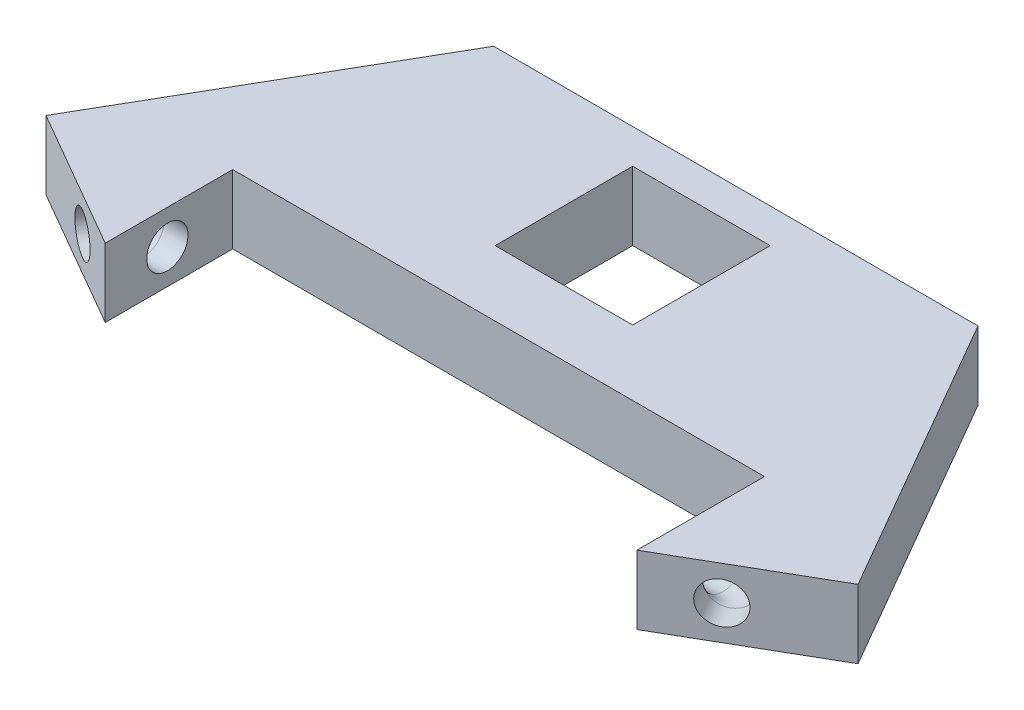
ISO-10303-21;
HEADER;
FILE_DESCRIPTION(('STEP AP214'),'2;1');
FILE_NAME('part.step','',(''),(''),'','','');
FILE_SCHEMA(('AUTOMOTIVE_DESIGN { 1 0 10303 214 1 1 1 1 }'));
ENDSEC;
DATA;
#1=APPLICATION_CONTEXT('core data for automotive mechanical design processes');
#2=APPLICATION_PROTOCOL_DEFINITION('international standard','automotive_design',2000,#1);
#3=PRODUCT_CONTEXT('',#1,'mechanical');
#4=PRODUCT('Part','Part','',(#3));
#5=PRODUCT_RELATED_PRODUCT_CATEGORY('part','',(#4));
#6=PRODUCT_DEFINITION_FORMATION('','',#4);
#7=PRODUCT_DEFINITION_CONTEXT('part definition',#1,'design');
#8=PRODUCT_DEFINITION('design','',#6,#7);
#9=PRODUCT_DEFINITION_SHAPE('','',#8);
#10=(LENGTH_UNIT() NAMED_UNIT(*) SI_UNIT(.MILLI.,.METRE.));
#11=(NAMED_UNIT(*) PLANE_ANGLE_UNIT() SI_UNIT($,.RADIAN.));
#12=(NAMED_UNIT(*) SI_UNIT($,.STERADIAN.) SOLID_ANGLE_UNIT());
#13=UNCERTAINTY_MEASURE_WITH_UNIT(LENGTH_MEASURE(1.E-05),#10,'distance_accuracy_value','');
#14=(GEOMETRIC_REPRESENTATION_CONTEXT(3) GLOBAL_UNCERTAINTY_ASSIGNED_CONTEXT((#13)) GLOBAL_UNIT_ASSIGNED_CONTEXT((#10,
#11,#12)) REPRESENTATION_CONTEXT('',''));
#15=CARTESIAN_POINT('',(0.,0.,0.));
#16=DIRECTION('',(0.,0.,1.));
#17=DIRECTION('',(1.,0.,0.));
#18=AXIS2_PLACEMENT_3D('',#15,#16,#17);
#19=CARTESIAN_POINT('',(-19.3308710467706,10.,-33.4820508075688));
#20=DIRECTION('',(-0.5,0.,-0.866025403784438));
#21=DIRECTION('',(-0.866025403784439,0.,0.5));
#22=AXIS2_PLACEMENT_3D('',#19,#20,#21);
#23=PLANE('',#22);
#24=CARTESIAN_POINT('',(46.4870596408467,5.,-71.4820508075689));
#25=DIRECTION('',(-0.5,0.,-0.866025403784438));
#26=DIRECTION('',(-0.866025403784439,0.,0.5));
#27=AXIS2_PLACEMENT_3D('',#24,#25,#26);
#28=CIRCLE('',#27,3.00000000000001);
#29=CARTESIAN_POINT('',(43.8889834294934,5.,-69.9820508075689));
#30=VERTEX_POINT('',#29);
#31=EDGE_CURVE('E427',#30,#30,#28,.T.);
#32=ORIENTED_EDGE('',*,*,#31,.T.);
#33=EDGE_LOOP('',(#32));
#34=FACE_BOUND('',#33,.T.);
#35=DIRECTION('',(0.866025403784439,0.,-0.5));
#36=VECTOR('',#35,1.);
#37=CARTESIAN_POINT('',(-19.3308710467706,0.,-33.4820508075688));
#38=LINE('',#37,#36);
#39=CARTESIAN_POINT('',(38.6617420935412,0.,-66.9641016151377));
#40=VERTEX_POINT('',#39);
#41=CARTESIAN_POINT('',(59.0444279957211,0.,-78.7320508075688));
#42=VERTEX_POINT('',#41);
#43=EDGE_CURVE('E170',#40,#42,#38,.T.);
#44=ORIENTED_EDGE('',*,*,#43,.T.);
#45=DIRECTION('',(0.,-1.,0.));
#46=VECTOR('',#45,1.);
#47=CARTESIAN_POINT('',(59.0444279957211,10.,-78.7320508075688));
#48=LINE('',#47,#46);
#49=CARTESIAN_POINT('',(59.0444279957211,10.,-78.7320508075688));
#50=VERTEX_POINT('',#49);
#51=EDGE_CURVE('E11',#50,#42,#48,.T.);
#52=ORIENTED_EDGE('',*,*,#51,.F.);
#53=DIRECTION('',(0.866025403784439,0.,-0.5));
#54=VECTOR('',#53,1.);
#55=CARTESIAN_POINT('',(-19.3308710467706,10.,-33.4820508075688));
#56=LINE('',#55,#54);
#57=CARTESIAN_POINT('',(38.6617420935412,10.,-66.9641016151377));
#58=VERTEX_POINT('',#57);
#59=EDGE_CURVE('E223',#58,#50,#56,.T.);
#60=ORIENTED_EDGE('',*,*,#59,.F.);
#61=DIRECTION('',(0.,-1.,0.));
#62=VECTOR('',#61,1.);
#63=CARTESIAN_POINT('',(38.6617420935412,10.,-66.9641016151377));
#64=LINE('',#63,#62);
#65=EDGE_CURVE('E189',#58,#40,#64,.T.);
#66=ORIENTED_EDGE('',*,*,#65,.T.);
#67=EDGE_LOOP('',(#44,#52,#60,#66));
#68=FACE_BOUND('',#67,.T.);
#69=ADVANCED_FACE('F33',(#34,#68),#23,.F.);
#70=CARTESIAN_POINT('',(78.3752990424917,10.,-45.25));
#71=DIRECTION('',(0.866025403784438,0.,-0.5));
#72=DIRECTION('',(-0.5,0.,-0.866025403784438));
#73=AXIS2_PLACEMENT_3D('',#70,#71,#72);
#74=PLANE('',#73);
#75=DIRECTION('',(0.5,0.,0.866025403784439));
#76=VECTOR('',#75,1.);
#77=CARTESIAN_POINT('',(78.3752990424917,0.,-45.25));
#78=LINE('',#77,#76);
#79=CARTESIAN_POINT('',(35.2183664205671,0.,-120.));
#80=VERTEX_POINT('',#79);
#81=EDGE_CURVE('E173',#80,#42,#78,.T.);
#82=ORIENTED_EDGE('',*,*,#81,.F.);
#83=DIRECTION('',(0.,-1.,0.));
#84=VECTOR('',#83,1.);
#85=CARTESIAN_POINT('',(35.2183664205671,10.,-120.));
#86=LINE('',#85,#84);
#87=CARTESIAN_POINT('',(35.2183664205671,10.,-120.));
#88=VERTEX_POINT('',#87);
#89=EDGE_CURVE('E43',#88,#80,#86,.T.);
#90=ORIENTED_EDGE('',*,*,#89,.F.);
#91=DIRECTION('',(0.5,0.,0.866025403784439));
#92=VECTOR('',#91,1.);
#93=CARTESIAN_POINT('',(78.3752990424917,10.,-45.25));
#94=LINE('',#93,#92);
#95=EDGE_CURVE('E226',#88,#50,#94,.T.);
#96=ORIENTED_EDGE('',*,*,#95,.T.);
#97=ORIENTED_EDGE('',*,*,#51,.T.);
#98=EDGE_LOOP('',(#82,#90,#96,#97));
#99=FACE_BOUND('',#98,.T.);
#100=ADVANCED_FACE('F261',(#99),#74,.T.);
#101=CARTESIAN_POINT('',(0.,10.,-120.));
#102=DIRECTION('',(0.,0.,-1.));
#103=DIRECTION('',(-1.,0.,0.));
#104=AXIS2_PLACEMENT_3D('',#101,#102,#103);
#105=PLANE('',#104);
#106=DIRECTION('',(1.,0.,0.));
#107=VECTOR('',#106,1.);
#108=CARTESIAN_POINT('',(0.,0.,-120.));
#109=LINE('',#108,#107);
#110=CARTESIAN_POINT('',(-35.2183664205671,0.,-120.));
#111=VERTEX_POINT('',#110);
#112=EDGE_CURVE('E176',#111,#80,#109,.T.);
#113=ORIENTED_EDGE('',*,*,#112,.F.);
#114=DIRECTION('',(0.,-1.,0.));
#115=VECTOR('',#114,1.);
#116=CARTESIAN_POINT('',(-35.2183664205671,10.,-120.));
#117=LINE('',#116,#115);
#118=CARTESIAN_POINT('',(-35.2183664205671,10.,-120.));
#119=VERTEX_POINT('',#118);
#120=EDGE_CURVE('E195',#119,#111,#117,.T.);
#121=ORIENTED_EDGE('',*,*,#120,.F.);
#122=DIRECTION('',(1.,0.,0.));
#123=VECTOR('',#122,1.);
#124=CARTESIAN_POINT('',(0.,10.,-120.));
#125=LINE('',#124,#123);
#126=EDGE_CURVE('E233',#119,#88,#125,.T.);
#127=ORIENTED_EDGE('',*,*,#126,.T.);
#128=ORIENTED_EDGE('',*,*,#89,.T.);
#129=EDGE_LOOP('',(#113,#121,#127,#128));
#130=FACE_BOUND('',#129,.T.);
#131=ADVANCED_FACE('F267',(#130),#105,.T.);
#132=CARTESIAN_POINT('',(-78.3752990424917,10.,-45.25));
#133=DIRECTION('',(-0.866025403784438,0.,-0.5));
#134=DIRECTION('',(-0.5,0.,0.866025403784439));
#135=AXIS2_PLACEMENT_3D('',#132,#133,#134);
#136=PLANE('',#135);
#137=DIRECTION('',(0.5,0.,-0.866025403784439));
#138=VECTOR('',#137,1.);
#139=CARTESIAN_POINT('',(-78.3752990424917,0.,-45.25));
#140=LINE('',#139,#138);
#141=CARTESIAN_POINT('',(-59.0444279957211,0.,-78.7320508075688));
#142=VERTEX_POINT('',#141);
#143=EDGE_CURVE('E179',#142,#111,#140,.T.);
#144=ORIENTED_EDGE('',*,*,#143,.F.);
#145=DIRECTION('',(0.,-1.,0.));
#146=VECTOR('',#145,1.);
#147=CARTESIAN_POINT('',(-59.0444279957211,10.,-78.7320508075688));
#148=LINE('',#147,#146);
#149=CARTESIAN_POINT('',(-59.0444279957211,10.,-78.7320508075688));
#150=VERTEX_POINT('',#149);
#151=EDGE_CURVE('E193',#150,#142,#148,.T.);
#152=ORIENTED_EDGE('',*,*,#151,.F.);
#153=DIRECTION('',(0.5,0.,-0.866025403784439));
#154=VECTOR('',#153,1.);
#155=CARTESIAN_POINT('',(-78.3752990424917,10.,-45.25));
#156=LINE('',#155,#154);
#157=EDGE_CURVE('E236',#150,#119,#156,.T.);
#158=ORIENTED_EDGE('',*,*,#157,.T.);
#159=ORIENTED_EDGE('',*,*,#120,.T.);
#160=EDGE_LOOP('',(#144,#152,#158,#159));
#161=FACE_BOUND('',#160,.T.);
#162=ADVANCED_FACE('F289',(#161),#136,.T.);
#163=CARTESIAN_POINT('',(19.3308710467706,10.,-33.4820508075686));
#164=DIRECTION('',(-0.500000000000002,0.,0.866025403784437));
#165=DIRECTION('',(0.866025403784437,0.,0.500000000000002));
#166=AXIS2_PLACEMENT_3D('',#163,#164,#165);
#167=PLANE('',#166);
#168=CARTESIAN_POINT('',(-46.4870596408467,5.,-71.4820508075688));
#169=DIRECTION('',(-0.500000000000002,0.,0.866025403784437));
#170=DIRECTION('',(0.866025403784437,0.,0.500000000000002));
#171=AXIS2_PLACEMENT_3D('',#168,#169,#170);
#172=CIRCLE('',#171,3.00000000000001);
#173=CARTESIAN_POINT('',(-43.8889834294934,5.,-69.9820508075688));
#174=VERTEX_POINT('',#173);
#175=EDGE_CURVE('E162',#174,#174,#172,.T.);
#176=ORIENTED_EDGE('',*,*,#175,.F.);
#177=EDGE_LOOP('',(#176));
#178=FACE_BOUND('',#177,.T.);
#179=DIRECTION('',(-0.866025403784437,0.,-0.500000000000002));
#180=VECTOR('',#179,1.);
#181=CARTESIAN_POINT('',(19.3308710467706,0.,-33.4820508075686));
#182=LINE('',#181,#180);
#183=CARTESIAN_POINT('',(-38.6617420935412,0.,-66.9641016151377));
#184=VERTEX_POINT('',#183);
#185=EDGE_CURVE('E182',#184,#142,#182,.T.);
#186=ORIENTED_EDGE('',*,*,#185,.F.);
#187=DIRECTION('',(0.,-1.,0.));
#188=VECTOR('',#187,1.);
#189=CARTESIAN_POINT('',(-38.6617420935412,10.,-66.9641016151377));
#190=LINE('',#189,#188);
#191=CARTESIAN_POINT('',(-38.6617420935412,10.,-66.9641016151377));
#192=VERTEX_POINT('',#191);
#193=EDGE_CURVE('E149',#192,#184,#190,.T.);
#194=ORIENTED_EDGE('',*,*,#193,.F.);
#195=DIRECTION('',(-0.866025403784437,0.,-0.500000000000002));
#196=VECTOR('',#195,1.);
#197=CARTESIAN_POINT('',(19.3308710467706,10.,-33.4820508075686));
#198=LINE('',#197,#196);
#199=EDGE_CURVE('E142',#192,#150,#198,.T.);
#200=ORIENTED_EDGE('',*,*,#199,.T.);
#201=ORIENTED_EDGE('',*,*,#151,.T.);
#202=EDGE_LOOP('',(#186,#194,#200,#201));
#203=FACE_BOUND('',#202,.T.);
#204=ADVANCED_FACE('F240',(#178,#203),#167,.T.);
#205=CARTESIAN_POINT('',(-38.6617420935412,10.,0.));
#206=DIRECTION('',(-1.,0.,0.));
#207=DIRECTION('',(0.,0.,1.));
#208=AXIS2_PLACEMENT_3D('',#205,#206,#207);
#209=PLANE('',#208);
#210=CARTESIAN_POINT('',(-38.6617420935412,5.,-76.));
#211=DIRECTION('',(-1.,0.,0.));
#212=DIRECTION('',(0.,0.,1.));
#213=AXIS2_PLACEMENT_3D('',#210,#211,#212);
#214=CIRCLE('',#213,3.00000000000001);
#215=CARTESIAN_POINT('',(-38.6617420935412,5.,-73.));
#216=VERTEX_POINT('',#215);
#217=EDGE_CURVE('E441',#216,#216,#214,.T.);
#218=ORIENTED_EDGE('',*,*,#217,.T.);
#219=EDGE_LOOP('',(#218));
#220=FACE_BOUND('',#219,.T.);
#221=DIRECTION('',(0.,0.,-1.));
#222=VECTOR('',#221,1.);
#223=CARTESIAN_POINT('',(-38.6617420935412,0.,0.));
#224=LINE('',#223,#222);
#225=CARTESIAN_POINT('',(-38.6617420935412,0.,-85.5));
#226=VERTEX_POINT('',#225);
#227=EDGE_CURVE('E148',#184,#226,#224,.T.);
#228=ORIENTED_EDGE('',*,*,#227,.T.);
#229=DIRECTION('',(0.,-1.,0.));
#230=VECTOR('',#229,1.);
#231=CARTESIAN_POINT('',(-38.6617420935412,10.,-85.5));
#232=LINE('',#231,#230);
#233=CARTESIAN_POINT('',(-38.6617420935412,10.,-85.5));
#234=VERTEX_POINT('',#233);
#235=EDGE_CURVE('E145',#234,#226,#232,.T.);
#236=ORIENTED_EDGE('',*,*,#235,.F.);
#237=DIRECTION('',(0.,0.,-1.));
#238=VECTOR('',#237,1.);
#239=CARTESIAN_POINT('',(-38.6617420935412,10.,0.));
#240=LINE('',#239,#238);
#241=EDGE_CURVE('E135',#192,#234,#240,.T.);
#242=ORIENTED_EDGE('',*,*,#241,.F.);
#243=ORIENTED_EDGE('',*,*,#193,.T.);
#244=EDGE_LOOP('',(#228,#236,#242,#243));
#245=FACE_BOUND('',#244,.T.);
#246=ADVANCED_FACE('F146',(#220,#245),#209,.F.);
#247=CARTESIAN_POINT('',(0.,10.,-85.5));
#248=DIRECTION('',(0.,0.,-1.));
#249=DIRECTION('',(-1.,0.,0.));
#250=AXIS2_PLACEMENT_3D('',#247,#248,#249);
#251=PLANE('',#250);
#252=DIRECTION('',(1.,0.,0.));
#253=VECTOR('',#252,1.);
#254=CARTESIAN_POINT('',(0.,0.,-85.5));
#255=LINE('',#254,#253);
#256=CARTESIAN_POINT('',(38.6617420935412,0.,-85.5));
#257=VERTEX_POINT('',#256);
#258=EDGE_CURVE('E93',#226,#257,#255,.T.);
#259=ORIENTED_EDGE('',*,*,#258,.T.);
#260=DIRECTION('',(0.,-1.,0.));
#261=VECTOR('',#260,1.);
#262=CARTESIAN_POINT('',(38.6617420935412,10.,-85.5));
#263=LINE('',#262,#261);
#264=CARTESIAN_POINT('',(38.6617420935412,10.,-85.5));
#265=VERTEX_POINT('',#264);
#266=EDGE_CURVE('E150',#265,#257,#263,.T.);
#267=ORIENTED_EDGE('',*,*,#266,.F.);
#268=DIRECTION('',(1.,0.,0.));
#269=VECTOR('',#268,1.);
#270=CARTESIAN_POINT('',(0.,10.,-85.5));
#271=LINE('',#270,#269);
#272=EDGE_CURVE('E139',#234,#265,#271,.T.);
#273=ORIENTED_EDGE('',*,*,#272,.F.);
#274=ORIENTED_EDGE('',*,*,#235,.T.);
#275=EDGE_LOOP('',(#259,#267,#273,#274));
#276=FACE_BOUND('',#275,.T.);
#277=ADVANCED_FACE('F152',(#276),#251,.F.);
#278=CARTESIAN_POINT('',(10.,10.,0.));
#279=DIRECTION('',(-1.,0.,0.));
#280=DIRECTION('',(0.,0.,1.));
#281=AXIS2_PLACEMENT_3D('',#278,#279,#280);
#282=PLANE('',#281);
#283=DIRECTION('',(0.,0.,-1.));
#284=VECTOR('',#283,1.);
#285=CARTESIAN_POINT('',(10.,0.,0.));
#286=LINE('',#285,#284);
#287=CARTESIAN_POINT('',(10.,0.,-95.));
#288=VERTEX_POINT('',#287);
#289=CARTESIAN_POINT('',(10.,0.,-115.));
#290=VERTEX_POINT('',#289);
#291=EDGE_CURVE('E158',#288,#290,#286,.T.);
#292=ORIENTED_EDGE('',*,*,#291,.F.);
#293=DIRECTION('',(0.,-1.,0.));
#294=VECTOR('',#293,1.);
#295=CARTESIAN_POINT('',(10.,10.,-95.));
#296=LINE('',#295,#294);
#297=CARTESIAN_POINT('',(10.,10.,-95.));
#298=VERTEX_POINT('',#297);
#299=EDGE_CURVE('E37',#298,#288,#296,.T.);
#300=ORIENTED_EDGE('',*,*,#299,.F.);
#301=DIRECTION('',(0.,0.,-1.));
#302=VECTOR('',#301,1.);
#303=CARTESIAN_POINT('',(10.,10.,0.));
#304=LINE('',#303,#302);
#305=CARTESIAN_POINT('',(10.,10.,-115.));
#306=VERTEX_POINT('',#305);
#307=EDGE_CURVE('E188',#298,#306,#304,.T.);
#308=ORIENTED_EDGE('',*,*,#307,.T.);
#309=DIRECTION('',(0.,-1.,0.));
#310=VECTOR('',#309,1.);
#311=CARTESIAN_POINT('',(10.,10.,-115.));
#312=LINE('',#311,#310);
#313=EDGE_CURVE('E154',#306,#290,#312,.T.);
#314=ORIENTED_EDGE('',*,*,#313,.T.);
#315=EDGE_LOOP('',(#292,#300,#308,#314));
#316=FACE_BOUND('',#315,.T.);
#317=ADVANCED_FACE('F35',(#316),#282,.T.);
#318=CARTESIAN_POINT('',(0.,10.,-95.));
#319=DIRECTION('',(0.,0.,-1.));
#320=DIRECTION('',(-1.,0.,0.));
#321=AXIS2_PLACEMENT_3D('',#318,#319,#320);
#322=PLANE('',#321);
#323=DIRECTION('',(1.,0.,0.));
#324=VECTOR('',#323,1.);
#325=CARTESIAN_POINT('',(0.,0.,-95.));
#326=LINE('',#325,#324);
#327=CARTESIAN_POINT('',(-10.,0.,-95.));
#328=VERTEX_POINT('',#327);
#329=EDGE_CURVE('E161',#328,#288,#326,.T.);
#330=ORIENTED_EDGE('',*,*,#329,.F.);
#331=DIRECTION('',(0.,-1.,0.));
#332=VECTOR('',#331,1.);
#333=CARTESIAN_POINT('',(-10.,10.,-95.));
#334=LINE('',#333,#332);
#335=CARTESIAN_POINT('',(-10.,10.,-95.));
#336=VERTEX_POINT('',#335);
#337=EDGE_CURVE('E201',#336,#328,#334,.T.);
#338=ORIENTED_EDGE('',*,*,#337,.F.);
#339=DIRECTION('',(1.,0.,0.));
#340=VECTOR('',#339,1.);
#341=CARTESIAN_POINT('',(0.,10.,-95.));
#342=LINE('',#341,#340);
#343=EDGE_CURVE('E210',#336,#298,#342,.T.);
#344=ORIENTED_EDGE('',*,*,#343,.T.);
#345=ORIENTED_EDGE('',*,*,#299,.T.);
#346=EDGE_LOOP('',(#330,#338,#344,#345));
#347=FACE_BOUND('',#346,.T.);
#348=ADVANCED_FACE('F208',(#347),#322,.T.);
#349=CARTESIAN_POINT('',(-10.,10.,0.));
#350=DIRECTION('',(-1.,0.,0.));
#351=DIRECTION('',(0.,0.,1.));
#352=AXIS2_PLACEMENT_3D('',#349,#350,#351);
#353=PLANE('',#352);
#354=DIRECTION('',(0.,0.,-1.));
#355=VECTOR('',#354,1.);
#356=CARTESIAN_POINT('',(-10.,0.,0.));
#357=LINE('',#356,#355);
#358=CARTESIAN_POINT('',(-10.,0.,-115.));
#359=VERTEX_POINT('',#358);
#360=EDGE_CURVE('E165',#328,#359,#357,.T.);
#361=ORIENTED_EDGE('',*,*,#360,.T.);
#362=DIRECTION('',(0.,-1.,0.));
#363=VECTOR('',#362,1.);
#364=CARTESIAN_POINT('',(-10.,10.,-115.));
#365=LINE('',#364,#363);
#366=CARTESIAN_POINT('',(-10.,10.,-115.));
#367=VERTEX_POINT('',#366);
#368=EDGE_CURVE('E199',#367,#359,#365,.T.);
#369=ORIENTED_EDGE('',*,*,#368,.F.);
#370=DIRECTION('',(0.,0.,-1.));
#371=VECTOR('',#370,1.);
#372=CARTESIAN_POINT('',(-10.,10.,0.));
#373=LINE('',#372,#371);
#374=EDGE_CURVE('E224',#336,#367,#373,.T.);
#375=ORIENTED_EDGE('',*,*,#374,.F.);
#376=ORIENTED_EDGE('',*,*,#337,.T.);
#377=EDGE_LOOP('',(#361,#369,#375,#376));
#378=FACE_BOUND('',#377,.T.);
#379=ADVANCED_FACE('F217',(#378),#353,.F.);
#380=CARTESIAN_POINT('',(0.,10.,-115.));
#381=DIRECTION('',(0.,0.,-1.));
#382=DIRECTION('',(-1.,0.,0.));
#383=AXIS2_PLACEMENT_3D('',#380,#381,#382);
#384=PLANE('',#383);
#385=DIRECTION('',(1.,0.,0.));
#386=VECTOR('',#385,1.);
#387=CARTESIAN_POINT('',(0.,0.,-115.));
#388=LINE('',#387,#386);
#389=EDGE_CURVE('E167',#359,#290,#388,.T.);
#390=ORIENTED_EDGE('',*,*,#389,.T.);
#391=ORIENTED_EDGE('',*,*,#313,.F.);
#392=DIRECTION('',(1.,0.,0.));
#393=VECTOR('',#392,1.);
#394=CARTESIAN_POINT('',(0.,10.,-115.));
#395=LINE('',#394,#393);
#396=EDGE_CURVE('E221',#367,#306,#395,.T.);
#397=ORIENTED_EDGE('',*,*,#396,.F.);
#398=ORIENTED_EDGE('',*,*,#368,.T.);
#399=EDGE_LOOP('',(#390,#391,#397,#398));
#400=FACE_BOUND('',#399,.T.);
#401=ADVANCED_FACE('F220',(#400),#384,.F.);
#402=CARTESIAN_POINT('',(38.6617420935412,10.,0.));
#403=DIRECTION('',(1.,0.,0.));
#404=DIRECTION('',(0.,0.,-1.));
#405=AXIS2_PLACEMENT_3D('',#402,#403,#404);
#406=PLANE('',#405);
#407=CARTESIAN_POINT('',(38.6617420935412,5.,-76.));
#408=DIRECTION('',(1.,0.,0.));
#409=DIRECTION('',(0.,0.,-1.));
#410=AXIS2_PLACEMENT_3D('',#407,#408,#409);
#411=CIRCLE('',#410,3.00000000000001);
#412=CARTESIAN_POINT('',(38.6617420935412,5.,-79.));
#413=VERTEX_POINT('',#412);
#414=EDGE_CURVE('E434',#413,#413,#411,.T.);
#415=ORIENTED_EDGE('',*,*,#414,.T.);
#416=EDGE_LOOP('',(#415));
#417=FACE_BOUND('',#416,.T.);
#418=DIRECTION('',(0.,0.,1.));
#419=VECTOR('',#418,1.);
#420=CARTESIAN_POINT('',(38.6617420935412,0.,0.));
#421=LINE('',#420,#419);
#422=EDGE_CURVE('E99',#257,#40,#421,.T.);
#423=ORIENTED_EDGE('',*,*,#422,.T.);
#424=ORIENTED_EDGE('',*,*,#65,.F.);
#425=DIRECTION('',(0.,0.,1.));
#426=VECTOR('',#425,1.);
#427=CARTESIAN_POINT('',(38.6617420935412,10.,0.));
#428=LINE('',#427,#426);
#429=EDGE_CURVE('E52',#265,#58,#428,.T.);
#430=ORIENTED_EDGE('',*,*,#429,.F.);
#431=ORIENTED_EDGE('',*,*,#266,.T.);
#432=EDGE_LOOP('',(#423,#424,#430,#431));
#433=FACE_BOUND('',#432,.T.);
#434=ADVANCED_FACE('F247',(#417,#433),#406,.F.);
#435=CARTESIAN_POINT('',(0.,10.,0.));
#436=DIRECTION('',(0.,1.,0.));
#437=DIRECTION('',(0.,0.,1.));
#438=AXIS2_PLACEMENT_3D('',#435,#436,#437);
#439=PLANE('',#438);
#440=ORIENTED_EDGE('',*,*,#307,.F.);
#441=ORIENTED_EDGE('',*,*,#343,.F.);
#442=ORIENTED_EDGE('',*,*,#374,.T.);
#443=ORIENTED_EDGE('',*,*,#396,.T.);
#444=EDGE_LOOP('',(#440,#441,#442,#443));
#445=FACE_BOUND('',#444,.T.);
#446=ORIENTED_EDGE('',*,*,#59,.T.);
#447=ORIENTED_EDGE('',*,*,#95,.F.);
#448=ORIENTED_EDGE('',*,*,#126,.F.);
#449=ORIENTED_EDGE('',*,*,#157,.F.);
#450=ORIENTED_EDGE('',*,*,#199,.F.);
#451=ORIENTED_EDGE('',*,*,#241,.T.);
#452=ORIENTED_EDGE('',*,*,#272,.T.);
#453=ORIENTED_EDGE('',*,*,#429,.T.);
#454=EDGE_LOOP('',(#446,#447,#448,#449,#450,#451,#452,#453));
#455=FACE_BOUND('',#454,.T.);
#456=ADVANCED_FACE('F137',(#445,#455),#439,.T.);
#457=CARTESIAN_POINT('',(0.,0.,0.));
#458=DIRECTION('',(0.,1.,0.));
#459=DIRECTION('',(0.,0.,1.));
#460=AXIS2_PLACEMENT_3D('',#457,#458,#459);
#461=PLANE('',#460);
#462=ORIENTED_EDGE('',*,*,#291,.T.);
#463=ORIENTED_EDGE('',*,*,#389,.F.);
#464=ORIENTED_EDGE('',*,*,#360,.F.);
#465=ORIENTED_EDGE('',*,*,#329,.T.);
#466=EDGE_LOOP('',(#462,#463,#464,#465));
#467=FACE_BOUND('',#466,.T.);
#468=ORIENTED_EDGE('',*,*,#43,.F.);
#469=ORIENTED_EDGE('',*,*,#422,.F.);
#470=ORIENTED_EDGE('',*,*,#258,.F.);
#471=ORIENTED_EDGE('',*,*,#227,.F.);
#472=ORIENTED_EDGE('',*,*,#185,.T.);
#473=ORIENTED_EDGE('',*,*,#143,.T.);
#474=ORIENTED_EDGE('',*,*,#112,.T.);
#475=ORIENTED_EDGE('',*,*,#81,.T.);
#476=EDGE_LOOP('',(#468,#469,#470,#471,#472,#473,#474,#475));
#477=FACE_BOUND('',#476,.T.);
#478=ADVANCED_FACE('F214',(#467,#477),#461,.F.);
#479=CARTESIAN_POINT('',(-44.744645862196,5.,-74.5));
#480=DIRECTION('',(-0.500000000000001,0.,0.866025403784438));
#481=DIRECTION('',(0.866025403784438,0.,0.500000000000001));
#482=AXIS2_PLACEMENT_3D('',#479,#480,#481);
#483=CYLINDRICAL_SURFACE('',#482,3.00000000000001);
#484=CARTESIAN_POINT('',(-44.744645862196,5.,-74.5));
#485=DIRECTION('',(0.499999999999996,0.,-0.866025403784441));
#486=DIRECTION('',(-0.866025403784441,0.,-0.499999999999996));
#487=AXIS2_PLACEMENT_3D('',#484,#485,#486);
#488=CIRCLE('',#487,3.00000000000001);
#489=CARTESIAN_POINT('',(-42.1465696508427,5.,-73.));
#490=VERTEX_POINT('',#489);
#491=EDGE_CURVE('E445',#490,#490,#488,.T.);
#492=ORIENTED_EDGE('',*,*,#491,.T.);
#493=EDGE_LOOP('',(#492));
#494=FACE_BOUND('',#493,.T.);
#495=ORIENTED_EDGE('',*,*,#175,.T.);
#496=EDGE_LOOP('',(#495));
#497=FACE_BOUND('',#496,.T.);
#498=ADVANCED_FACE('F321',(#494,#497),#483,.F.);
#499=CARTESIAN_POINT('',(-37.6617420935412,5.,-76.));
#500=DIRECTION('',(-1.,0.,0.));
#501=DIRECTION('',(0.,0.,1.));
#502=AXIS2_PLACEMENT_3D('',#499,#500,#501);
#503=CYLINDRICAL_SURFACE('',#502,3.00000000000001);
#504=ORIENTED_EDGE('',*,*,#217,.F.);
#505=EDGE_LOOP('',(#504));
#506=FACE_BOUND('',#505,.T.);
#507=CARTESIAN_POINT('',(-42.1465696508427,5.,-76.));
#508=DIRECTION('',(1.,0.,0.));
#509=DIRECTION('',(0.,0.,-1.));
#510=AXIS2_PLACEMENT_3D('',#507,#508,#509);
#511=CIRCLE('',#510,3.00000000000001);
#512=EDGE_CURVE('E444',#490,#490,#511,.T.);
#513=ORIENTED_EDGE('',*,*,#512,.F.);
#514=EDGE_LOOP('',(#513));
#515=FACE_BOUND('',#514,.T.);
#516=ADVANCED_FACE('F326',(#506,#515),#503,.F.);
#517=CARTESIAN_POINT('',(-42.1465696508427,5.,-70.0000000000001));
#518=DIRECTION('',(-1.,0.,0.));
#519=DIRECTION('',(0.,0.,1.));
#520=AXIS2_PLACEMENT_3D('',#517,#518,#519);
#521=CIRCLE('',#520,3.00000000000001);
#522=TRIMMED_CURVE('',#521,(PARAMETER_VALUE(-3.14159230190976)),
(PARAMETER_VALUE(3.14159230190976)),.T.,.PARAMETER.);
#523=CARTESIAN_POINT('',(-42.1465696508427,5.,-73.));
#524=DIRECTION('',(0.,1.,0.));
#525=AXIS1_PLACEMENT('',#523,#524);
#526=SURFACE_OF_REVOLUTION('',#522,#525);
#527=ORIENTED_EDGE('',*,*,#491,.F.);
#528=ORIENTED_EDGE('',*,*,#512,.T.);
#529=EDGE_LOOP('',(#527,#528));
#530=FACE_BOUND('',#529,.T.);
#531=ADVANCED_FACE('F329',(#530),#526,.F.);
#532=CARTESIAN_POINT('',(37.6617420935412,5.,-76.));
#533=DIRECTION('',(1.,0.,0.));
#534=DIRECTION('',(0.,0.,-1.));
#535=AXIS2_PLACEMENT_3D('',#532,#533,#534);
#536=CYLINDRICAL_SURFACE('',#535,3.00000000000001);
#537=ORIENTED_EDGE('',*,*,#414,.F.);
#538=EDGE_LOOP('',(#537));
#539=FACE_BOUND('',#538,.T.);
#540=CARTESIAN_POINT('',(42.1465696508427,5.,-76.));
#541=DIRECTION('',(1.,0.,0.));
#542=DIRECTION('',(0.,0.,-1.));
#543=AXIS2_PLACEMENT_3D('',#540,#541,#542);
#544=CIRCLE('',#543,3.00000000000001);
#545=CARTESIAN_POINT('',(42.1465696508427,5.,-73.));
#546=VERTEX_POINT('',#545);
#547=EDGE_CURVE('E435',#546,#546,#544,.F.);
#548=ORIENTED_EDGE('',*,*,#547,.F.);
#549=EDGE_LOOP('',(#548));
#550=FACE_BOUND('',#549,.T.);
#551=ADVANCED_FACE('F348',(#539,#550),#536,.F.);
#552=CARTESIAN_POINT('',(42.1465696508427,5.,-75.9999999999998));
#553=DIRECTION('',(-1.,0.,0.));
#554=DIRECTION('',(0.,0.,-1.));
#555=AXIS2_PLACEMENT_3D('',#552,#553,#554);
#556=CIRCLE('',#555,3.00000000000001);
#557=TRIMMED_CURVE('',#556,(PARAMETER_VALUE(-3.14159230190976)),
(PARAMETER_VALUE(3.14159230190976)),.T.,.PARAMETER.);
#558=CARTESIAN_POINT('',(42.1465696508427,5.,-73.));
#559=DIRECTION('',(0.,-1.,0.));
#560=AXIS1_PLACEMENT('',#558,#559);
#561=SURFACE_OF_REVOLUTION('',#557,#560);
#562=CARTESIAN_POINT('',(44.744645862196,5.,-74.5));
#563=DIRECTION('',(0.499999999999996,0.,0.866025403784441));
#564=DIRECTION('',(0.866025403784441,0.,-0.499999999999996));
#565=AXIS2_PLACEMENT_3D('',#562,#563,#564);
#566=CIRCLE('',#565,3.00000000000001);
#567=EDGE_CURVE('E431',#546,#546,#566,.F.);
#568=ORIENTED_EDGE('',*,*,#567,.F.);
#569=ORIENTED_EDGE('',*,*,#547,.T.);
#570=EDGE_LOOP('',(#568,#569));
#571=FACE_BOUND('',#570,.T.);
#572=ADVANCED_FACE('F371',(#571),#561,.F.);
#573=CARTESIAN_POINT('',(44.744645862196,5.,-74.5));
#574=DIRECTION('',(0.500000000000001,0.,0.866025403784438));
#575=DIRECTION('',(0.866025403784438,0.,-0.500000000000001));
#576=AXIS2_PLACEMENT_3D('',#573,#574,#575);
#577=CYLINDRICAL_SURFACE('',#576,3.00000000000001);
#578=ORIENTED_EDGE('',*,*,#31,.F.);
#579=EDGE_LOOP('',(#578));
#580=FACE_BOUND('',#579,.T.);
#581=ORIENTED_EDGE('',*,*,#567,.T.);
#582=EDGE_LOOP('',(#581));
#583=FACE_BOUND('',#582,.T.);
#584=ADVANCED_FACE('F341',(#580,#583),#577,.F.);
#585=CLOSED_SHELL('',(#69,#100,#131,#162,#204,#246,#277,#317,#348,#379,#401,#434,#456,#478,#498,
#516,#531,#551,#572,#584));
#586=MANIFOLD_SOLID_BREP('B2',#585);
#587=ADVANCED_BREP_SHAPE_REPRESENTATION('',(#18,#586),#14);
#588=SHAPE_DEFINITION_REPRESENTATION(#9,#587);
ENDSEC;
END-ISO-10303-21;
